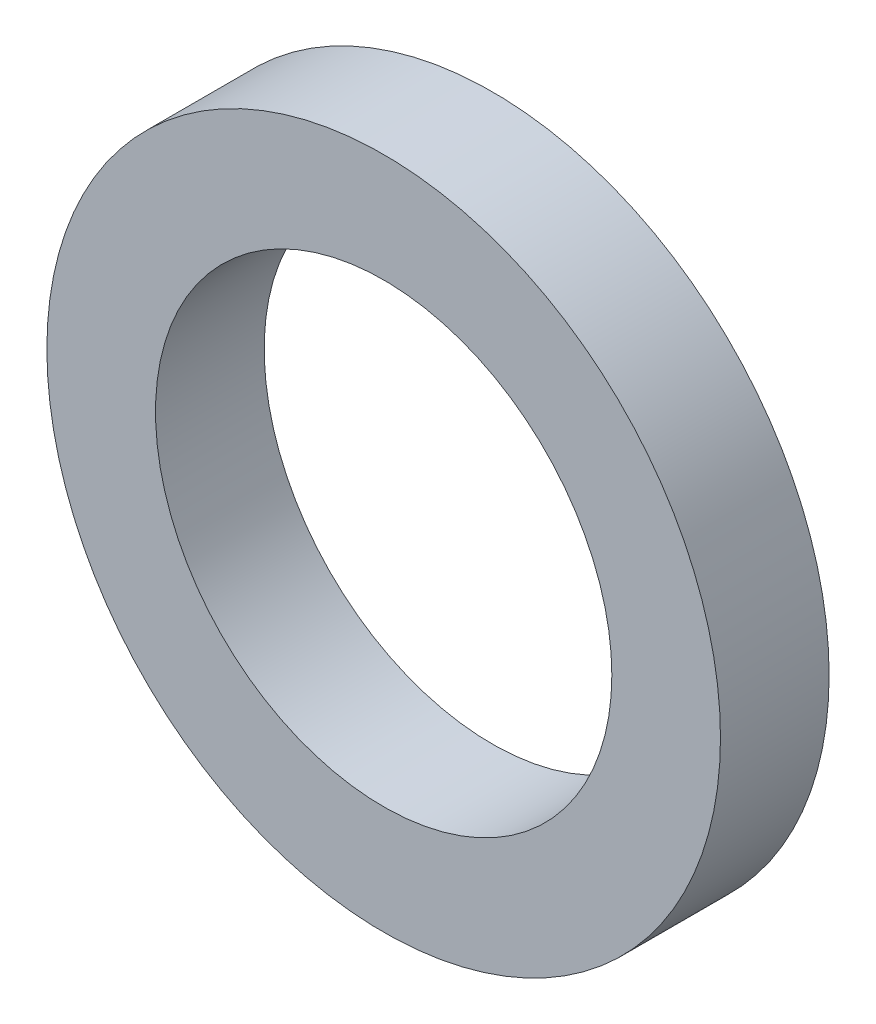
ISO-10303-21;
HEADER;
FILE_DESCRIPTION(('STEP AP214'),'2;1');
FILE_NAME('part.step','',(''),(''),'','','');
FILE_SCHEMA(('AUTOMOTIVE_DESIGN { 1 0 10303 214 1 1 1 1 }'));
ENDSEC;
DATA;
#1=APPLICATION_CONTEXT('core data for automotive mechanical design processes');
#2=APPLICATION_PROTOCOL_DEFINITION('international standard','automotive_design',2000,#1);
#3=PRODUCT_CONTEXT('',#1,'mechanical');
#4=PRODUCT('Part','Part','',(#3));
#5=PRODUCT_RELATED_PRODUCT_CATEGORY('part','',(#4));
#6=PRODUCT_DEFINITION_FORMATION('','',#4);
#7=PRODUCT_DEFINITION_CONTEXT('part definition',#1,'design');
#8=PRODUCT_DEFINITION('design','',#6,#7);
#9=PRODUCT_DEFINITION_SHAPE('','',#8);
#10=(LENGTH_UNIT() NAMED_UNIT(*) SI_UNIT(.MILLI.,.METRE.));
#11=(NAMED_UNIT(*) PLANE_ANGLE_UNIT() SI_UNIT($,.RADIAN.));
#12=(NAMED_UNIT(*) SI_UNIT($,.STERADIAN.) SOLID_ANGLE_UNIT());
#13=UNCERTAINTY_MEASURE_WITH_UNIT(LENGTH_MEASURE(1.E-05),#10,'distance_accuracy_value','');
#14=(GEOMETRIC_REPRESENTATION_CONTEXT(3) GLOBAL_UNCERTAINTY_ASSIGNED_CONTEXT((#13)) GLOBAL_UNIT_ASSIGNED_CONTEXT((#10,
#11,#12)) REPRESENTATION_CONTEXT('',''));
#15=CARTESIAN_POINT('',(0.,0.,0.));
#16=DIRECTION('',(0.,0.,1.));
#17=DIRECTION('',(1.,0.,0.));
#18=AXIS2_PLACEMENT_3D('',#15,#16,#17);
#19=CARTESIAN_POINT('',(0.,0.,1.));
#20=DIRECTION('',(0.,0.,-1.));
#21=DIRECTION('',(-1.,0.,0.));
#22=AXIS2_PLACEMENT_3D('',#19,#20,#21);
#23=CYLINDRICAL_SURFACE('',#22,3.1);
#24=CARTESIAN_POINT('',(0.,0.,1.));
#25=DIRECTION('',(0.,0.,1.));
#26=DIRECTION('',(1.,0.,0.));
#27=AXIS2_PLACEMENT_3D('',#24,#25,#26);
#28=CIRCLE('',#27,3.1);
#29=CARTESIAN_POINT('',(3.1,0.,1.));
#30=VERTEX_POINT('',#29);
#31=EDGE_CURVE('E10',#30,#30,#28,.T.);
#32=ORIENTED_EDGE('',*,*,#31,.F.);
#33=EDGE_LOOP('',(#32));
#34=FACE_BOUND('',#33,.T.);
#35=CARTESIAN_POINT('',(0.,0.,0.));
#36=DIRECTION('',(0.,0.,1.));
#37=DIRECTION('',(1.,0.,0.));
#38=AXIS2_PLACEMENT_3D('',#35,#36,#37);
#39=CIRCLE('',#38,3.1);
#40=CARTESIAN_POINT('',(3.1,0.,0.));
#41=VERTEX_POINT('',#40);
#42=EDGE_CURVE('E40',#41,#41,#39,.T.);
#43=ORIENTED_EDGE('',*,*,#42,.T.);
#44=EDGE_LOOP('',(#43));
#45=FACE_BOUND('',#44,.T.);
#46=ADVANCED_FACE('F37',(#34,#45),#23,.T.);
#47=CARTESIAN_POINT('',(0.,0.,1.));
#48=DIRECTION('',(0.,0.,1.));
#49=DIRECTION('',(1.,0.,0.));
#50=AXIS2_PLACEMENT_3D('',#47,#48,#49);
#51=PLANE('',#50);
#52=CARTESIAN_POINT('',(0.,0.,1.));
#53=DIRECTION('',(0.,0.,1.));
#54=DIRECTION('',(1.,0.,0.));
#55=AXIS2_PLACEMENT_3D('',#52,#53,#54);
#56=CIRCLE('',#55,2.1);
#57=CARTESIAN_POINT('',(2.1,0.,1.));
#58=VERTEX_POINT('',#57);
#59=EDGE_CURVE('E51',#58,#58,#56,.T.);
#60=ORIENTED_EDGE('',*,*,#59,.F.);
#61=EDGE_LOOP('',(#60));
#62=FACE_BOUND('',#61,.T.);
#63=ORIENTED_EDGE('',*,*,#31,.T.);
#64=EDGE_LOOP('',(#63));
#65=FACE_BOUND('',#64,.T.);
#66=ADVANCED_FACE('F68',(#62,#65),#51,.T.);
#67=CARTESIAN_POINT('',(0.,0.,0.));
#68=DIRECTION('',(0.,0.,1.));
#69=DIRECTION('',(1.,0.,0.));
#70=AXIS2_PLACEMENT_3D('',#67,#68,#69);
#71=PLANE('',#70);
#72=CARTESIAN_POINT('',(0.,0.,0.));
#73=DIRECTION('',(0.,0.,1.));
#74=DIRECTION('',(1.,0.,0.));
#75=AXIS2_PLACEMENT_3D('',#72,#73,#74);
#76=CIRCLE('',#75,2.1);
#77=CARTESIAN_POINT('',(2.1,0.,0.));
#78=VERTEX_POINT('',#77);
#79=EDGE_CURVE('E49',#78,#78,#76,.T.);
#80=ORIENTED_EDGE('',*,*,#79,.T.);
#81=EDGE_LOOP('',(#80));
#82=FACE_BOUND('',#81,.T.);
#83=ORIENTED_EDGE('',*,*,#42,.F.);
#84=EDGE_LOOP('',(#83));
#85=FACE_BOUND('',#84,.T.);
#86=ADVANCED_FACE('F59',(#82,#85),#71,.F.);
#87=CARTESIAN_POINT('',(0.,0.,0.));
#88=DIRECTION('',(0.,0.,1.));
#89=DIRECTION('',(1.,0.,0.));
#90=AXIS2_PLACEMENT_3D('',#87,#88,#89);
#91=CYLINDRICAL_SURFACE('',#90,2.1);
#92=ORIENTED_EDGE('',*,*,#79,.F.);
#93=EDGE_LOOP('',(#92));
#94=FACE_BOUND('',#93,.T.);
#95=ORIENTED_EDGE('',*,*,#59,.T.);
#96=EDGE_LOOP('',(#95));
#97=FACE_BOUND('',#96,.T.);
#98=ADVANCED_FACE('F62',(#94,#97),#91,.F.);
#99=CLOSED_SHELL('',(#46,#66,#86,#98));
#100=MANIFOLD_SOLID_BREP('B2',#99);
#101=ADVANCED_BREP_SHAPE_REPRESENTATION('',(#18,#100),#14);
#102=SHAPE_DEFINITION_REPRESENTATION(#9,#101);
ENDSEC;
END-ISO-10303-21;
